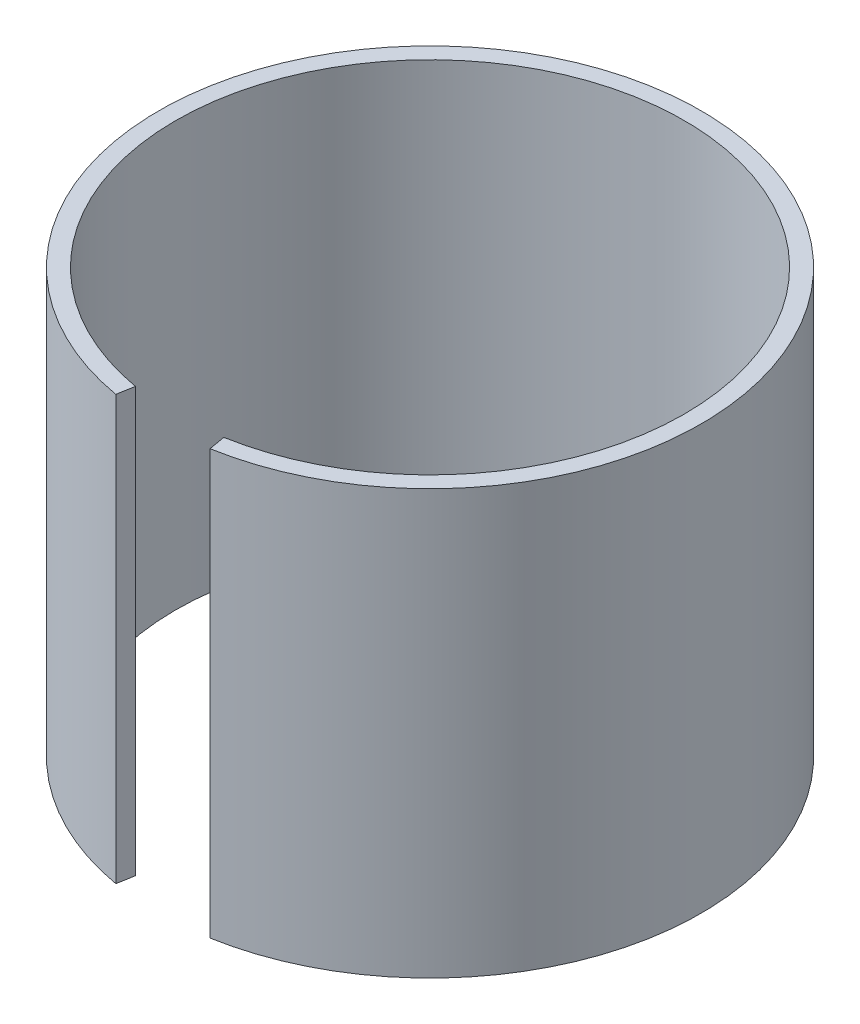
ISO-10303-21;
HEADER;
FILE_DESCRIPTION(('STEP AP214'),'2;1');
FILE_NAME('part.step','',(''),(''),'','','');
FILE_SCHEMA(('AUTOMOTIVE_DESIGN { 1 0 10303 214 1 1 1 1 }'));
ENDSEC;
DATA;
#1=APPLICATION_CONTEXT('core data for automotive mechanical design processes');
#2=APPLICATION_PROTOCOL_DEFINITION('international standard','automotive_design',2000,#1);
#3=PRODUCT_CONTEXT('',#1,'mechanical');
#4=PRODUCT('Part','Part','',(#3));
#5=PRODUCT_RELATED_PRODUCT_CATEGORY('part','',(#4));
#6=PRODUCT_DEFINITION_FORMATION('','',#4);
#7=PRODUCT_DEFINITION_CONTEXT('part definition',#1,'design');
#8=PRODUCT_DEFINITION('design','',#6,#7);
#9=PRODUCT_DEFINITION_SHAPE('','',#8);
#10=(LENGTH_UNIT() NAMED_UNIT(*) SI_UNIT(.MILLI.,.METRE.));
#11=(NAMED_UNIT(*) PLANE_ANGLE_UNIT() SI_UNIT($,.RADIAN.));
#12=(NAMED_UNIT(*) SI_UNIT($,.STERADIAN.) SOLID_ANGLE_UNIT());
#13=UNCERTAINTY_MEASURE_WITH_UNIT(LENGTH_MEASURE(1.E-05),#10,'distance_accuracy_value','');
#14=(GEOMETRIC_REPRESENTATION_CONTEXT(3) GLOBAL_UNCERTAINTY_ASSIGNED_CONTEXT((#13)) GLOBAL_UNIT_ASSIGNED_CONTEXT((#10,
#11,#12)) REPRESENTATION_CONTEXT('',''));
#15=CARTESIAN_POINT('',(0.,0.,0.));
#16=DIRECTION('',(0.,0.,1.));
#17=DIRECTION('',(1.,0.,0.));
#18=AXIS2_PLACEMENT_3D('',#15,#16,#17);
#19=CARTESIAN_POINT('',(0.,50.,0.));
#20=DIRECTION('',(0.,-1.,0.));
#21=DIRECTION('',(0.,0.,-1.));
#22=AXIS2_PLACEMENT_3D('',#19,#20,#21);
#23=CYLINDRICAL_SURFACE('',#22,30.);
#24=CARTESIAN_POINT('',(0.,0.,0.));
#25=DIRECTION('',(0.,-1.,0.));
#26=DIRECTION('',(0.,0.,1.));
#27=AXIS2_PLACEMENT_3D('',#24,#25,#26);
#28=CIRCLE('',#27,30.);
#29=CARTESIAN_POINT('',(-5.20944533000792,0.,29.5442325903662));
#30=VERTEX_POINT('',#29);
#31=CARTESIAN_POINT('',(5.20944533000794,0.,29.5442325903662));
#32=VERTEX_POINT('',#31);
#33=EDGE_CURVE('E100',#30,#32,#28,.T.);
#34=ORIENTED_EDGE('',*,*,#33,.T.);
#35=DIRECTION('',(0.,-1.,0.));
#36=VECTOR('',#35,1.);
#37=CARTESIAN_POINT('',(5.20944533000794,50.,29.5442325903662));
#38=LINE('',#37,#36);
#39=CARTESIAN_POINT('',(5.20944533000794,50.,29.5442325903662));
#40=VERTEX_POINT('',#39);
#41=EDGE_CURVE('E11',#40,#32,#38,.T.);
#42=ORIENTED_EDGE('',*,*,#41,.F.);
#43=CARTESIAN_POINT('',(0.,50.,0.));
#44=DIRECTION('',(0.,-1.,0.));
#45=DIRECTION('',(0.,0.,1.));
#46=AXIS2_PLACEMENT_3D('',#43,#44,#45);
#47=CIRCLE('',#46,30.);
#48=CARTESIAN_POINT('',(-5.20944533000792,50.,29.5442325903662));
#49=VERTEX_POINT('',#48);
#50=EDGE_CURVE('E88',#49,#40,#47,.T.);
#51=ORIENTED_EDGE('',*,*,#50,.F.);
#52=DIRECTION('',(0.,-1.,0.));
#53=VECTOR('',#52,1.);
#54=CARTESIAN_POINT('',(-5.20944533000792,50.,29.5442325903662));
#55=LINE('',#54,#53);
#56=EDGE_CURVE('E96',#49,#30,#55,.T.);
#57=ORIENTED_EDGE('',*,*,#56,.T.);
#58=EDGE_LOOP('',(#34,#42,#51,#57));
#59=FACE_BOUND('',#58,.T.);
#60=ADVANCED_FACE('F37',(#59),#23,.F.);
#61=CARTESIAN_POINT('',(5.20944533000794,50.,29.5442325903662));
#62=DIRECTION('',(0.984807753012208,0.,-0.173648177666931));
#63=DIRECTION('',(-0.173648177666931,0.,-0.984807753012208));
#64=AXIS2_PLACEMENT_3D('',#61,#62,#63);
#65=PLANE('',#64);
#66=DIRECTION('',(0.173648177666931,0.,0.984807753012208));
#67=VECTOR('',#66,1.);
#68=CARTESIAN_POINT('',(5.20944533000794,0.,29.5442325903662));
#69=LINE('',#68,#67);
#70=CARTESIAN_POINT('',(5.5567416853418,0.,31.5138480963907));
#71=VERTEX_POINT('',#70);
#72=EDGE_CURVE('E92',#32,#71,#69,.T.);
#73=ORIENTED_EDGE('',*,*,#72,.T.);
#74=DIRECTION('',(0.,-1.,0.));
#75=VECTOR('',#74,1.);
#76=CARTESIAN_POINT('',(5.5567416853418,50.,31.5138480963907));
#77=LINE('',#76,#75);
#78=CARTESIAN_POINT('',(5.5567416853418,50.,31.5138480963907));
#79=VERTEX_POINT('',#78);
#80=EDGE_CURVE('E45',#79,#71,#77,.T.);
#81=ORIENTED_EDGE('',*,*,#80,.F.);
#82=DIRECTION('',(0.173648177666931,0.,0.984807753012208));
#83=VECTOR('',#82,1.);
#84=CARTESIAN_POINT('',(5.20944533000794,50.,29.5442325903662));
#85=LINE('',#84,#83);
#86=EDGE_CURVE('E83',#40,#79,#85,.T.);
#87=ORIENTED_EDGE('',*,*,#86,.F.);
#88=ORIENTED_EDGE('',*,*,#41,.T.);
#89=EDGE_LOOP('',(#73,#81,#87,#88));
#90=FACE_BOUND('',#89,.T.);
#91=ADVANCED_FACE('F91',(#90),#65,.F.);
#92=CARTESIAN_POINT('',(0.,50.,0.));
#93=DIRECTION('',(0.,-1.,0.));
#94=DIRECTION('',(0.,0.,-1.));
#95=AXIS2_PLACEMENT_3D('',#92,#93,#94);
#96=CYLINDRICAL_SURFACE('',#95,32.);
#97=CARTESIAN_POINT('',(0.,0.,0.));
#98=DIRECTION('',(0.,1.,0.));
#99=DIRECTION('',(0.,0.,1.));
#100=AXIS2_PLACEMENT_3D('',#97,#98,#99);
#101=CIRCLE('',#100,32.);
#102=CARTESIAN_POINT('',(-5.55674168534178,0.,31.5138480963907));
#103=VERTEX_POINT('',#102);
#104=EDGE_CURVE('E70',#71,#103,#101,.T.);
#105=ORIENTED_EDGE('',*,*,#104,.T.);
#106=DIRECTION('',(0.,-1.,0.));
#107=VECTOR('',#106,1.);
#108=CARTESIAN_POINT('',(-5.55674168534178,50.,31.5138480963907));
#109=LINE('',#108,#107);
#110=CARTESIAN_POINT('',(-5.55674168534178,50.,31.5138480963907));
#111=VERTEX_POINT('',#110);
#112=EDGE_CURVE('E93',#111,#103,#109,.T.);
#113=ORIENTED_EDGE('',*,*,#112,.F.);
#114=CARTESIAN_POINT('',(0.,50.,0.));
#115=DIRECTION('',(0.,1.,0.));
#116=DIRECTION('',(0.,0.,1.));
#117=AXIS2_PLACEMENT_3D('',#114,#115,#116);
#118=CIRCLE('',#117,32.);
#119=EDGE_CURVE('E86',#79,#111,#118,.T.);
#120=ORIENTED_EDGE('',*,*,#119,.F.);
#121=ORIENTED_EDGE('',*,*,#80,.T.);
#122=EDGE_LOOP('',(#105,#113,#120,#121));
#123=FACE_BOUND('',#122,.T.);
#124=ADVANCED_FACE('F94',(#123),#96,.T.);
#125=CARTESIAN_POINT('',(-5.20944533000792,50.,29.5442325903662));
#126=DIRECTION('',(-0.984807753012208,0.,-0.173648177666931));
#127=DIRECTION('',(-0.173648177666931,0.,0.984807753012208));
#128=AXIS2_PLACEMENT_3D('',#125,#126,#127);
#129=PLANE('',#128);
#130=DIRECTION('',(0.173648177666931,0.,-0.984807753012208));
#131=VECTOR('',#130,1.);
#132=CARTESIAN_POINT('',(-5.20944533000792,0.,29.5442325903662));
#133=LINE('',#132,#131);
#134=EDGE_CURVE('E76',#103,#30,#133,.T.);
#135=ORIENTED_EDGE('',*,*,#134,.T.);
#136=ORIENTED_EDGE('',*,*,#56,.F.);
#137=DIRECTION('',(0.173648177666931,0.,-0.984807753012208));
#138=VECTOR('',#137,1.);
#139=CARTESIAN_POINT('',(-5.20944533000792,50.,29.5442325903662));
#140=LINE('',#139,#138);
#141=EDGE_CURVE('E53',#111,#49,#140,.T.);
#142=ORIENTED_EDGE('',*,*,#141,.F.);
#143=ORIENTED_EDGE('',*,*,#112,.T.);
#144=EDGE_LOOP('',(#135,#136,#142,#143));
#145=FACE_BOUND('',#144,.T.);
#146=ADVANCED_FACE('F107',(#145),#129,.F.);
#147=CARTESIAN_POINT('',(0.,50.,0.));
#148=DIRECTION('',(0.,1.,0.));
#149=DIRECTION('',(0.,0.,1.));
#150=AXIS2_PLACEMENT_3D('',#147,#148,#149);
#151=PLANE('',#150);
#152=ORIENTED_EDGE('',*,*,#50,.T.);
#153=ORIENTED_EDGE('',*,*,#86,.T.);
#154=ORIENTED_EDGE('',*,*,#119,.T.);
#155=ORIENTED_EDGE('',*,*,#141,.T.);
#156=EDGE_LOOP('',(#152,#153,#154,#155));
#157=FACE_BOUND('',#156,.T.);
#158=ADVANCED_FACE('F84',(#157),#151,.T.);
#159=CARTESIAN_POINT('',(0.,0.,0.));
#160=DIRECTION('',(0.,1.,0.));
#161=DIRECTION('',(0.,0.,1.));
#162=AXIS2_PLACEMENT_3D('',#159,#160,#161);
#163=PLANE('',#162);
#164=ORIENTED_EDGE('',*,*,#33,.F.);
#165=ORIENTED_EDGE('',*,*,#134,.F.);
#166=ORIENTED_EDGE('',*,*,#104,.F.);
#167=ORIENTED_EDGE('',*,*,#72,.F.);
#168=EDGE_LOOP('',(#164,#165,#166,#167));
#169=FACE_BOUND('',#168,.T.);
#170=ADVANCED_FACE('F110',(#169),#163,.F.);
#171=CLOSED_SHELL('',(#60,#91,#124,#146,#158,#170));
#172=MANIFOLD_SOLID_BREP('B2',#171);
#173=ADVANCED_BREP_SHAPE_REPRESENTATION('',(#18,#172),#14);
#174=SHAPE_DEFINITION_REPRESENTATION(#9,#173);
ENDSEC;
END-ISO-10303-21;
